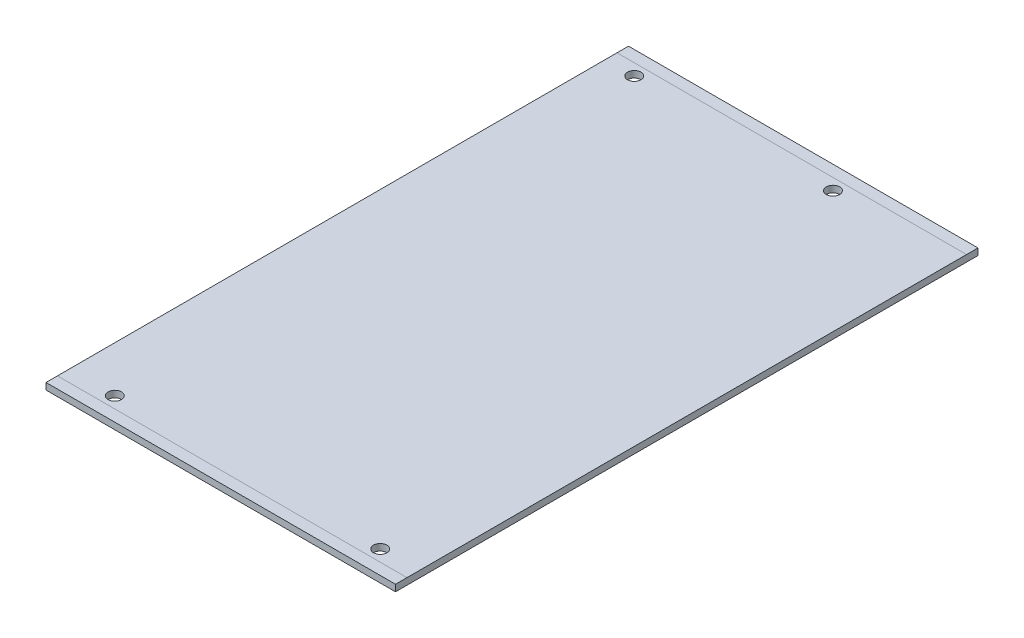
ISO-10303-21;
HEADER;
FILE_DESCRIPTION(('STEP AP214'),'2;1');
FILE_NAME('part.step','',(''),(''),'','','');
FILE_SCHEMA(('AUTOMOTIVE_DESIGN { 1 0 10303 214 1 1 1 1 }'));
ENDSEC;
DATA;
#1=APPLICATION_CONTEXT('core data for automotive mechanical design processes');
#2=APPLICATION_PROTOCOL_DEFINITION('international standard','automotive_design',2000,#1);
#3=PRODUCT_CONTEXT('',#1,'mechanical');
#4=PRODUCT('Part','Part','',(#3));
#5=PRODUCT_RELATED_PRODUCT_CATEGORY('part','',(#4));
#6=PRODUCT_DEFINITION_FORMATION('','',#4);
#7=PRODUCT_DEFINITION_CONTEXT('part definition',#1,'design');
#8=PRODUCT_DEFINITION('design','',#6,#7);
#9=PRODUCT_DEFINITION_SHAPE('','',#8);
#10=(LENGTH_UNIT() NAMED_UNIT(*) SI_UNIT(.MILLI.,.METRE.));
#11=(NAMED_UNIT(*) PLANE_ANGLE_UNIT() SI_UNIT($,.RADIAN.));
#12=(NAMED_UNIT(*) SI_UNIT($,.STERADIAN.) SOLID_ANGLE_UNIT());
#13=UNCERTAINTY_MEASURE_WITH_UNIT(LENGTH_MEASURE(1.E-05),#10,'distance_accuracy_value','');
#14=(GEOMETRIC_REPRESENTATION_CONTEXT(3) GLOBAL_UNCERTAINTY_ASSIGNED_CONTEXT((#13)) GLOBAL_UNIT_ASSIGNED_CONTEXT((#10,
#11,#12)) REPRESENTATION_CONTEXT('',''));
#15=CARTESIAN_POINT('',(0.,0.,0.));
#16=DIRECTION('',(0.,0.,1.));
#17=DIRECTION('',(1.,0.,0.));
#18=AXIS2_PLACEMENT_3D('',#15,#16,#17);
#19=CARTESIAN_POINT('',(-45.72,1.724,-76.2));
#20=DIRECTION('',(0.,0.,1.));
#21=DIRECTION('',(1.,0.,0.));
#22=AXIS2_PLACEMENT_3D('',#19,#20,#21);
#23=PLANE('',#22);
#24=DIRECTION('',(-1.,0.,0.));
#25=VECTOR('',#24,1.);
#26=CARTESIAN_POINT('',(-45.72,1.7239,-76.2));
#27=LINE('',#26,#25);
#28=CARTESIAN_POINT('',(45.72,1.7239,-76.2));
#29=VERTEX_POINT('',#28);
#30=CARTESIAN_POINT('',(-45.72,1.7239,-76.2));
#31=VERTEX_POINT('',#30);
#32=EDGE_CURVE('E164',#29,#31,#27,.T.);
#33=ORIENTED_EDGE('',*,*,#32,.F.);
#34=DIRECTION('',(0.,-1.,0.));
#35=VECTOR('',#34,1.);
#36=CARTESIAN_POINT('',(45.72,1.724,-76.2));
#37=LINE('',#36,#35);
#38=CARTESIAN_POINT('',(45.72,0.,-76.2));
#39=VERTEX_POINT('',#38);
#40=EDGE_CURVE('E11',#29,#39,#37,.T.);
#41=ORIENTED_EDGE('',*,*,#40,.T.);
#42=DIRECTION('',(-1.,0.,0.));
#43=VECTOR('',#42,1.);
#44=CARTESIAN_POINT('',(-45.72,0.,-76.2));
#45=LINE('',#44,#43);
#46=CARTESIAN_POINT('',(-45.72,0.,-76.2));
#47=VERTEX_POINT('',#46);
#48=EDGE_CURVE('E129',#39,#47,#45,.T.);
#49=ORIENTED_EDGE('',*,*,#48,.T.);
#50=DIRECTION('',(0.,-1.,0.));
#51=VECTOR('',#50,1.);
#52=CARTESIAN_POINT('',(-45.72,1.724,-76.2));
#53=LINE('',#52,#51);
#54=EDGE_CURVE('E39',#31,#47,#53,.T.);
#55=ORIENTED_EDGE('',*,*,#54,.F.);
#56=EDGE_LOOP('',(#33,#41,#49,#55));
#57=FACE_BOUND('',#56,.T.);
#58=ADVANCED_FACE('F31',(#57),#23,.F.);
#59=CARTESIAN_POINT('',(45.72,1.724,76.2));
#60=DIRECTION('',(-1.,0.,0.));
#61=DIRECTION('',(0.,0.,1.));
#62=AXIS2_PLACEMENT_3D('',#59,#60,#61);
#63=PLANE('',#62);
#64=DIRECTION('',(0.,0.,-1.));
#65=VECTOR('',#64,1.);
#66=CARTESIAN_POINT('',(45.72,1.724,76.2));
#67=LINE('',#66,#65);
#68=CARTESIAN_POINT('',(45.72,1.724,73.2));
#69=VERTEX_POINT('',#68);
#70=CARTESIAN_POINT('',(45.72,1.724,-73.2));
#71=VERTEX_POINT('',#70);
#72=EDGE_CURVE('E127',#69,#71,#67,.T.);
#73=ORIENTED_EDGE('',*,*,#72,.F.);
#74=DIRECTION('',(0.,1.,0.));
#75=VECTOR('',#74,1.);
#76=CARTESIAN_POINT('',(45.72,1.7239,73.2));
#77=LINE('',#76,#75);
#78=CARTESIAN_POINT('',(45.72,1.7239,73.2));
#79=VERTEX_POINT('',#78);
#80=EDGE_CURVE('E46',#79,#69,#77,.T.);
#81=ORIENTED_EDGE('',*,*,#80,.F.);
#82=DIRECTION('',(0.,0.,-1.));
#83=VECTOR('',#82,1.);
#84=CARTESIAN_POINT('',(45.72,1.7239,76.2));
#85=LINE('',#84,#83);
#86=CARTESIAN_POINT('',(45.72,1.7239,76.2));
#87=VERTEX_POINT('',#86);
#88=EDGE_CURVE('E115',#87,#79,#85,.T.);
#89=ORIENTED_EDGE('',*,*,#88,.F.);
#90=DIRECTION('',(0.,-1.,0.));
#91=VECTOR('',#90,1.);
#92=CARTESIAN_POINT('',(45.72,1.724,76.2));
#93=LINE('',#92,#91);
#94=CARTESIAN_POINT('',(45.72,0.,76.2));
#95=VERTEX_POINT('',#94);
#96=EDGE_CURVE('E114',#87,#95,#93,.T.);
#97=ORIENTED_EDGE('',*,*,#96,.T.);
#98=DIRECTION('',(0.,0.,-1.));
#99=VECTOR('',#98,1.);
#100=CARTESIAN_POINT('',(45.72,0.,76.2));
#101=LINE('',#100,#99);
#102=EDGE_CURVE('E132',#95,#39,#101,.T.);
#103=ORIENTED_EDGE('',*,*,#102,.T.);
#104=ORIENTED_EDGE('',*,*,#40,.F.);
#105=DIRECTION('',(0.,0.,-1.));
#106=VECTOR('',#105,1.);
#107=CARTESIAN_POINT('',(45.72,1.7239,-76.2));
#108=LINE('',#107,#106);
#109=CARTESIAN_POINT('',(45.72,1.7239,-73.2));
#110=VERTEX_POINT('',#109);
#111=EDGE_CURVE('E172',#110,#29,#108,.T.);
#112=ORIENTED_EDGE('',*,*,#111,.F.);
#113=DIRECTION('',(0.,1.,0.));
#114=VECTOR('',#113,1.);
#115=CARTESIAN_POINT('',(45.72,1.7239,-73.2));
#116=LINE('',#115,#114);
#117=EDGE_CURVE('E160',#110,#71,#116,.T.);
#118=ORIENTED_EDGE('',*,*,#117,.T.);
#119=EDGE_LOOP('',(#73,#81,#89,#97,#103,#104,#112,#118));
#120=FACE_BOUND('',#119,.T.);
#121=ADVANCED_FACE('F33',(#120),#63,.F.);
#122=CARTESIAN_POINT('',(-45.72,1.724,76.2));
#123=DIRECTION('',(1.,0.,0.));
#124=DIRECTION('',(0.,0.,-1.));
#125=AXIS2_PLACEMENT_3D('',#122,#123,#124);
#126=PLANE('',#125);
#127=DIRECTION('',(0.,0.,1.));
#128=VECTOR('',#127,1.);
#129=CARTESIAN_POINT('',(-45.72,1.7239,76.2));
#130=LINE('',#129,#128);
#131=CARTESIAN_POINT('',(-45.72,1.7239,73.2));
#132=VERTEX_POINT('',#131);
#133=CARTESIAN_POINT('',(-45.72,1.7239,76.2));
#134=VERTEX_POINT('',#133);
#135=EDGE_CURVE('E97',#132,#134,#130,.T.);
#136=ORIENTED_EDGE('',*,*,#135,.F.);
#137=DIRECTION('',(0.,1.,0.));
#138=VECTOR('',#137,1.);
#139=CARTESIAN_POINT('',(-45.72,1.7239,73.2));
#140=LINE('',#139,#138);
#141=CARTESIAN_POINT('',(-45.72,1.724,73.2));
#142=VERTEX_POINT('',#141);
#143=EDGE_CURVE('E170',#132,#142,#140,.T.);
#144=ORIENTED_EDGE('',*,*,#143,.T.);
#145=DIRECTION('',(0.,0.,1.));
#146=VECTOR('',#145,1.);
#147=CARTESIAN_POINT('',(-45.72,1.724,76.2));
#148=LINE('',#147,#146);
#149=CARTESIAN_POINT('',(-45.72,1.724,-73.2));
#150=VERTEX_POINT('',#149);
#151=EDGE_CURVE('E122',#150,#142,#148,.T.);
#152=ORIENTED_EDGE('',*,*,#151,.F.);
#153=DIRECTION('',(0.,1.,0.));
#154=VECTOR('',#153,1.);
#155=CARTESIAN_POINT('',(-45.72,1.7239,-73.2));
#156=LINE('',#155,#154);
#157=CARTESIAN_POINT('',(-45.72,1.7239,-73.2));
#158=VERTEX_POINT('',#157);
#159=EDGE_CURVE('E54',#158,#150,#156,.T.);
#160=ORIENTED_EDGE('',*,*,#159,.F.);
#161=DIRECTION('',(0.,0.,1.));
#162=VECTOR('',#161,1.);
#163=CARTESIAN_POINT('',(-45.72,1.7239,-76.2));
#164=LINE('',#163,#162);
#165=EDGE_CURVE('E169',#31,#158,#164,.T.);
#166=ORIENTED_EDGE('',*,*,#165,.F.);
#167=ORIENTED_EDGE('',*,*,#54,.T.);
#168=DIRECTION('',(0.,0.,1.));
#169=VECTOR('',#168,1.);
#170=CARTESIAN_POINT('',(-45.72,0.,76.2));
#171=LINE('',#170,#169);
#172=CARTESIAN_POINT('',(-45.72,0.,76.2));
#173=VERTEX_POINT('',#172);
#174=EDGE_CURVE('E119',#47,#173,#171,.T.);
#175=ORIENTED_EDGE('',*,*,#174,.T.);
#176=DIRECTION('',(0.,-1.,0.));
#177=VECTOR('',#176,1.);
#178=CARTESIAN_POINT('',(-45.72,1.724,76.2));
#179=LINE('',#178,#177);
#180=EDGE_CURVE('E112',#134,#173,#179,.T.);
#181=ORIENTED_EDGE('',*,*,#180,.F.);
#182=EDGE_LOOP('',(#136,#144,#152,#160,#166,#167,#175,#181));
#183=FACE_BOUND('',#182,.T.);
#184=ADVANCED_FACE('F117',(#183),#126,.F.);
#185=CARTESIAN_POINT('',(-45.72,1.724,76.2));
#186=DIRECTION('',(0.,0.,-1.));
#187=DIRECTION('',(-1.,0.,0.));
#188=AXIS2_PLACEMENT_3D('',#185,#186,#187);
#189=PLANE('',#188);
#190=ORIENTED_EDGE('',*,*,#96,.F.);
#191=DIRECTION('',(1.,0.,0.));
#192=VECTOR('',#191,1.);
#193=CARTESIAN_POINT('',(-45.72,1.7239,76.2));
#194=LINE('',#193,#192);
#195=EDGE_CURVE('E100',#134,#87,#194,.T.);
#196=ORIENTED_EDGE('',*,*,#195,.F.);
#197=ORIENTED_EDGE('',*,*,#180,.T.);
#198=DIRECTION('',(1.,0.,0.));
#199=VECTOR('',#198,1.);
#200=CARTESIAN_POINT('',(-45.72,0.,76.2));
#201=LINE('',#200,#199);
#202=EDGE_CURVE('E125',#173,#95,#201,.T.);
#203=ORIENTED_EDGE('',*,*,#202,.T.);
#204=EDGE_LOOP('',(#190,#196,#197,#203));
#205=FACE_BOUND('',#204,.T.);
#206=ADVANCED_FACE('F110',(#205),#189,.F.);
#207=CARTESIAN_POINT('',(45.72,1.724,-76.2));
#208=DIRECTION('',(0.,-1.,0.));
#209=DIRECTION('',(0.,0.,-1.));
#210=AXIS2_PLACEMENT_3D('',#207,#208,#209);
#211=PLANE('',#210);
#212=CARTESIAN_POINT('',(-38.22,1.724,-70.2));
#213=DIRECTION('',(0.,1.,0.));
#214=DIRECTION('',(0.,0.,1.));
#215=AXIS2_PLACEMENT_3D('',#212,#213,#214);
#216=CIRCLE('',#215,1.75);
#217=CARTESIAN_POINT('',(-38.22,1.724,-68.45));
#218=VERTEX_POINT('',#217);
#219=EDGE_CURVE('E154',#218,#218,#216,.T.);
#220=ORIENTED_EDGE('',*,*,#219,.F.);
#221=EDGE_LOOP('',(#220));
#222=FACE_BOUND('',#221,.T.);
#223=CARTESIAN_POINT('',(13.78,1.724,-70.2));
#224=DIRECTION('',(0.,1.,0.));
#225=DIRECTION('',(0.,0.,1.));
#226=AXIS2_PLACEMENT_3D('',#223,#224,#225);
#227=CIRCLE('',#226,1.75);
#228=CARTESIAN_POINT('',(13.78,1.724,-68.45));
#229=VERTEX_POINT('',#228);
#230=EDGE_CURVE('E148',#229,#229,#227,.T.);
#231=ORIENTED_EDGE('',*,*,#230,.F.);
#232=EDGE_LOOP('',(#231));
#233=FACE_BOUND('',#232,.T.);
#234=CARTESIAN_POINT('',(-33.72,1.724,70.2));
#235=DIRECTION('',(0.,1.,0.));
#236=DIRECTION('',(0.,0.,1.));
#237=AXIS2_PLACEMENT_3D('',#234,#235,#236);
#238=CIRCLE('',#237,1.75);
#239=CARTESIAN_POINT('',(-33.72,1.724,71.95));
#240=VERTEX_POINT('',#239);
#241=EDGE_CURVE('E142',#240,#240,#238,.T.);
#242=ORIENTED_EDGE('',*,*,#241,.F.);
#243=EDGE_LOOP('',(#242));
#244=FACE_BOUND('',#243,.T.);
#245=CARTESIAN_POINT('',(35.72,1.724,70.2));
#246=DIRECTION('',(0.,1.,0.));
#247=DIRECTION('',(0.,0.,1.));
#248=AXIS2_PLACEMENT_3D('',#245,#246,#247);
#249=CIRCLE('',#248,1.75);
#250=CARTESIAN_POINT('',(35.72,1.724,71.95));
#251=VERTEX_POINT('',#250);
#252=EDGE_CURVE('E135',#251,#251,#249,.T.);
#253=ORIENTED_EDGE('',*,*,#252,.F.);
#254=EDGE_LOOP('',(#253));
#255=FACE_BOUND('',#254,.T.);
#256=ORIENTED_EDGE('',*,*,#151,.T.);
#257=DIRECTION('',(-1.,0.,0.));
#258=VECTOR('',#257,1.);
#259=CARTESIAN_POINT('',(-45.72,1.724,73.2));
#260=LINE('',#259,#258);
#261=EDGE_CURVE('E106',#69,#142,#260,.T.);
#262=ORIENTED_EDGE('',*,*,#261,.F.);
#263=ORIENTED_EDGE('',*,*,#72,.T.);
#264=DIRECTION('',(1.,0.,0.));
#265=VECTOR('',#264,1.);
#266=CARTESIAN_POINT('',(-45.72,1.724,-73.2));
#267=LINE('',#266,#265);
#268=EDGE_CURVE('E167',#150,#71,#267,.T.);
#269=ORIENTED_EDGE('',*,*,#268,.F.);
#270=EDGE_LOOP('',(#256,#262,#263,#269));
#271=FACE_BOUND('',#270,.T.);
#272=ADVANCED_FACE('F188',(#222,#233,#244,#255,#271),#211,.F.);
#273=CARTESIAN_POINT('',(45.72,0.,-76.2));
#274=DIRECTION('',(0.,-1.,0.));
#275=DIRECTION('',(0.,0.,-1.));
#276=AXIS2_PLACEMENT_3D('',#273,#274,#275);
#277=PLANE('',#276);
#278=CARTESIAN_POINT('',(-38.22,0.,-70.2));
#279=DIRECTION('',(0.,-1.,0.));
#280=DIRECTION('',(0.,0.,-1.));
#281=AXIS2_PLACEMENT_3D('',#278,#279,#280);
#282=CIRCLE('',#281,1.75);
#283=CARTESIAN_POINT('',(-38.22,0.,-71.95));
#284=VERTEX_POINT('',#283);
#285=EDGE_CURVE('E157',#284,#284,#282,.F.);
#286=ORIENTED_EDGE('',*,*,#285,.T.);
#287=EDGE_LOOP('',(#286));
#288=FACE_BOUND('',#287,.T.);
#289=CARTESIAN_POINT('',(13.78,0.,-70.2));
#290=DIRECTION('',(0.,-1.,0.));
#291=DIRECTION('',(0.,0.,-1.));
#292=AXIS2_PLACEMENT_3D('',#289,#290,#291);
#293=CIRCLE('',#292,1.75);
#294=CARTESIAN_POINT('',(13.78,0.,-71.95));
#295=VERTEX_POINT('',#294);
#296=EDGE_CURVE('E151',#295,#295,#293,.F.);
#297=ORIENTED_EDGE('',*,*,#296,.T.);
#298=EDGE_LOOP('',(#297));
#299=FACE_BOUND('',#298,.T.);
#300=CARTESIAN_POINT('',(-33.72,0.,70.2));
#301=DIRECTION('',(0.,-1.,0.));
#302=DIRECTION('',(0.,0.,-1.));
#303=AXIS2_PLACEMENT_3D('',#300,#301,#302);
#304=CIRCLE('',#303,1.75);
#305=CARTESIAN_POINT('',(-33.72,0.,68.45));
#306=VERTEX_POINT('',#305);
#307=EDGE_CURVE('E145',#306,#306,#304,.F.);
#308=ORIENTED_EDGE('',*,*,#307,.T.);
#309=EDGE_LOOP('',(#308));
#310=FACE_BOUND('',#309,.T.);
#311=CARTESIAN_POINT('',(35.72,0.,70.2));
#312=DIRECTION('',(0.,-1.,0.));
#313=DIRECTION('',(0.,0.,-1.));
#314=AXIS2_PLACEMENT_3D('',#311,#312,#313);
#315=CIRCLE('',#314,1.75);
#316=CARTESIAN_POINT('',(35.72,0.,68.45));
#317=VERTEX_POINT('',#316);
#318=EDGE_CURVE('E139',#317,#317,#315,.F.);
#319=ORIENTED_EDGE('',*,*,#318,.T.);
#320=EDGE_LOOP('',(#319));
#321=FACE_BOUND('',#320,.T.);
#322=ORIENTED_EDGE('',*,*,#102,.F.);
#323=ORIENTED_EDGE('',*,*,#202,.F.);
#324=ORIENTED_EDGE('',*,*,#174,.F.);
#325=ORIENTED_EDGE('',*,*,#48,.F.);
#326=EDGE_LOOP('',(#322,#323,#324,#325));
#327=FACE_BOUND('',#326,.T.);
#328=ADVANCED_FACE('F201',(#288,#299,#310,#321,#327),#277,.T.);
#329=CARTESIAN_POINT('',(35.72,-0.000999999999999916,70.2));
#330=DIRECTION('',(0.,1.,0.));
#331=DIRECTION('',(0.,0.,1.));
#332=AXIS2_PLACEMENT_3D('',#329,#330,#331);
#333=CYLINDRICAL_SURFACE('',#332,1.75);
#334=ORIENTED_EDGE('',*,*,#318,.F.);
#335=EDGE_LOOP('',(#334));
#336=FACE_BOUND('',#335,.T.);
#337=ORIENTED_EDGE('',*,*,#252,.T.);
#338=EDGE_LOOP('',(#337));
#339=FACE_BOUND('',#338,.T.);
#340=ADVANCED_FACE('F203',(#336,#339),#333,.F.);
#341=CARTESIAN_POINT('',(-33.72,-0.000999999999999916,70.2));
#342=DIRECTION('',(0.,1.,0.));
#343=DIRECTION('',(0.,0.,1.));
#344=AXIS2_PLACEMENT_3D('',#341,#342,#343);
#345=CYLINDRICAL_SURFACE('',#344,1.75);
#346=ORIENTED_EDGE('',*,*,#307,.F.);
#347=EDGE_LOOP('',(#346));
#348=FACE_BOUND('',#347,.T.);
#349=ORIENTED_EDGE('',*,*,#241,.T.);
#350=EDGE_LOOP('',(#349));
#351=FACE_BOUND('',#350,.T.);
#352=ADVANCED_FACE('F210',(#348,#351),#345,.F.);
#353=CARTESIAN_POINT('',(13.78,-0.000999999999999916,-70.2));
#354=DIRECTION('',(0.,1.,0.));
#355=DIRECTION('',(0.,0.,1.));
#356=AXIS2_PLACEMENT_3D('',#353,#354,#355);
#357=CYLINDRICAL_SURFACE('',#356,1.75);
#358=ORIENTED_EDGE('',*,*,#296,.F.);
#359=EDGE_LOOP('',(#358));
#360=FACE_BOUND('',#359,.T.);
#361=ORIENTED_EDGE('',*,*,#230,.T.);
#362=EDGE_LOOP('',(#361));
#363=FACE_BOUND('',#362,.T.);
#364=ADVANCED_FACE('F274',(#360,#363),#357,.F.);
#365=CARTESIAN_POINT('',(-38.22,-0.000999999999999916,-70.2));
#366=DIRECTION('',(0.,1.,0.));
#367=DIRECTION('',(0.,0.,1.));
#368=AXIS2_PLACEMENT_3D('',#365,#366,#367);
#369=CYLINDRICAL_SURFACE('',#368,1.75);
#370=ORIENTED_EDGE('',*,*,#285,.F.);
#371=EDGE_LOOP('',(#370));
#372=FACE_BOUND('',#371,.T.);
#373=ORIENTED_EDGE('',*,*,#219,.T.);
#374=EDGE_LOOP('',(#373));
#375=FACE_BOUND('',#374,.T.);
#376=ADVANCED_FACE('F242',(#372,#375),#369,.F.);
#377=CARTESIAN_POINT('',(-45.72,1.7239,-73.2));
#378=DIRECTION('',(0.,0.,1.));
#379=DIRECTION('',(1.,0.,0.));
#380=AXIS2_PLACEMENT_3D('',#377,#378,#379);
#381=PLANE('',#380);
#382=ORIENTED_EDGE('',*,*,#268,.T.);
#383=ORIENTED_EDGE('',*,*,#117,.F.);
#384=DIRECTION('',(1.,0.,0.));
#385=VECTOR('',#384,1.);
#386=CARTESIAN_POINT('',(-45.72,1.7239,-73.2));
#387=LINE('',#386,#385);
#388=EDGE_CURVE('E174',#158,#110,#387,.T.);
#389=ORIENTED_EDGE('',*,*,#388,.F.);
#390=ORIENTED_EDGE('',*,*,#159,.T.);
#391=EDGE_LOOP('',(#382,#383,#389,#390));
#392=FACE_BOUND('',#391,.T.);
#393=ADVANCED_FACE('F190',(#392),#381,.F.);
#394=CARTESIAN_POINT('',(-45.72,1.7239,-73.2));
#395=DIRECTION('',(0.,1.,0.));
#396=DIRECTION('',(0.,0.,1.));
#397=AXIS2_PLACEMENT_3D('',#394,#395,#396);
#398=PLANE('',#397);
#399=ORIENTED_EDGE('',*,*,#165,.T.);
#400=ORIENTED_EDGE('',*,*,#388,.T.);
#401=ORIENTED_EDGE('',*,*,#111,.T.);
#402=ORIENTED_EDGE('',*,*,#32,.T.);
#403=EDGE_LOOP('',(#399,#400,#401,#402));
#404=FACE_BOUND('',#403,.T.);
#405=ADVANCED_FACE('F192',(#404),#398,.T.);
#406=CARTESIAN_POINT('',(-45.72,1.7239,73.2));
#407=DIRECTION('',(0.,0.,-1.));
#408=DIRECTION('',(-1.,0.,0.));
#409=AXIS2_PLACEMENT_3D('',#406,#407,#408);
#410=PLANE('',#409);
#411=ORIENTED_EDGE('',*,*,#261,.T.);
#412=ORIENTED_EDGE('',*,*,#143,.F.);
#413=DIRECTION('',(-1.,0.,0.));
#414=VECTOR('',#413,1.);
#415=CARTESIAN_POINT('',(-45.72,1.7239,73.2));
#416=LINE('',#415,#414);
#417=EDGE_CURVE('E102',#79,#132,#416,.T.);
#418=ORIENTED_EDGE('',*,*,#417,.F.);
#419=ORIENTED_EDGE('',*,*,#80,.T.);
#420=EDGE_LOOP('',(#411,#412,#418,#419));
#421=FACE_BOUND('',#420,.T.);
#422=ADVANCED_FACE('F184',(#421),#410,.F.);
#423=CARTESIAN_POINT('',(-45.72,1.7239,73.2));
#424=DIRECTION('',(0.,-1.,0.));
#425=DIRECTION('',(0.,0.,-1.));
#426=AXIS2_PLACEMENT_3D('',#423,#424,#425);
#427=PLANE('',#426);
#428=ORIENTED_EDGE('',*,*,#135,.T.);
#429=ORIENTED_EDGE('',*,*,#195,.T.);
#430=ORIENTED_EDGE('',*,*,#88,.T.);
#431=ORIENTED_EDGE('',*,*,#417,.T.);
#432=EDGE_LOOP('',(#428,#429,#430,#431));
#433=FACE_BOUND('',#432,.T.);
#434=ADVANCED_FACE('F99',(#433),#427,.F.);
#435=CLOSED_SHELL('',(#58,#121,#184,#206,#272,#328,#340,#352,#364,#376,#393,#405,#422,#434));
#436=MANIFOLD_SOLID_BREP('B2',#435);
#437=ADVANCED_BREP_SHAPE_REPRESENTATION('',(#18,#436),#14);
#438=SHAPE_DEFINITION_REPRESENTATION(#9,#437);
ENDSEC;
END-ISO-10303-21;
